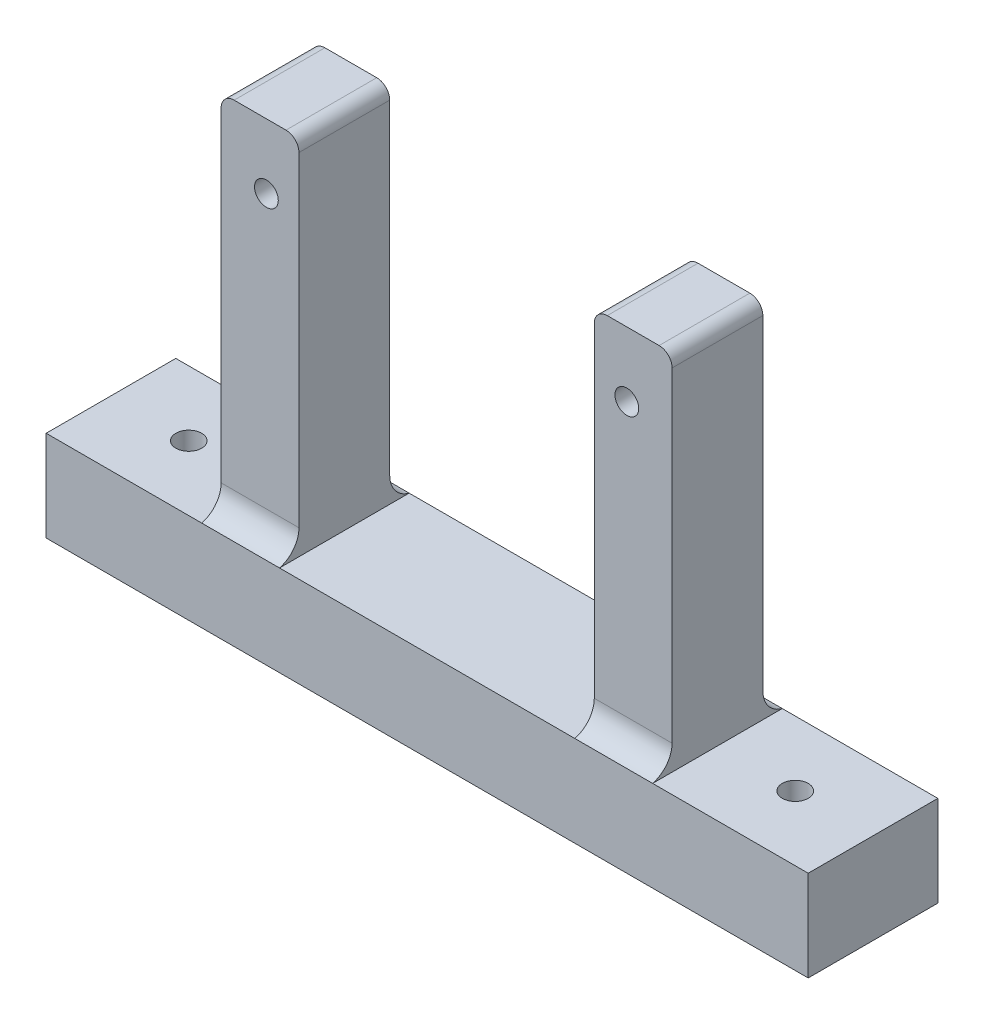
ISO-10303-21;
HEADER;
FILE_DESCRIPTION(('STEP AP214'),'2;1');
FILE_NAME('part.step','',(''),(''),'','','');
FILE_SCHEMA(('AUTOMOTIVE_DESIGN { 1 0 10303 214 1 1 1 1 }'));
ENDSEC;
DATA;
#1=APPLICATION_CONTEXT('core data for automotive mechanical design processes');
#2=APPLICATION_PROTOCOL_DEFINITION('international standard','automotive_design',2000,#1);
#3=PRODUCT_CONTEXT('',#1,'mechanical');
#4=PRODUCT('Part','Part','',(#3));
#5=PRODUCT_RELATED_PRODUCT_CATEGORY('part','',(#4));
#6=PRODUCT_DEFINITION_FORMATION('','',#4);
#7=PRODUCT_DEFINITION_CONTEXT('part definition',#1,'design');
#8=PRODUCT_DEFINITION('design','',#6,#7);
#9=PRODUCT_DEFINITION_SHAPE('','',#8);
#10=(LENGTH_UNIT() NAMED_UNIT(*) SI_UNIT(.MILLI.,.METRE.));
#11=(NAMED_UNIT(*) PLANE_ANGLE_UNIT() SI_UNIT($,.RADIAN.));
#12=(NAMED_UNIT(*) SI_UNIT($,.STERADIAN.) SOLID_ANGLE_UNIT());
#13=UNCERTAINTY_MEASURE_WITH_UNIT(LENGTH_MEASURE(1.E-05),#10,'distance_accuracy_value','');
#14=(GEOMETRIC_REPRESENTATION_CONTEXT(3) GLOBAL_UNCERTAINTY_ASSIGNED_CONTEXT((#13)) GLOBAL_UNIT_ASSIGNED_CONTEXT((#10,
#11,#12)) REPRESENTATION_CONTEXT('',''));
#15=CARTESIAN_POINT('',(0.,0.,0.));
#16=DIRECTION('',(0.,0.,1.));
#17=DIRECTION('',(1.,0.,0.));
#18=AXIS2_PLACEMENT_3D('',#15,#16,#17);
#19=CARTESIAN_POINT('',(0.,7.,0.));
#20=DIRECTION('',(0.,-1.,0.));
#21=DIRECTION('',(0.,0.,-1.));
#22=AXIS2_PLACEMENT_3D('',#19,#20,#21);
#23=PLANE('',#22);
#24=CARTESIAN_POINT('',(-23.39,7.,0.));
#25=DIRECTION('',(0.,1.,0.));
#26=DIRECTION('',(0.,0.,1.));
#27=AXIS2_PLACEMENT_3D('',#24,#25,#26);
#28=CIRCLE('',#27,1.);
#29=CARTESIAN_POINT('',(-23.39,7.,1.));
#30=VERTEX_POINT('',#29);
#31=EDGE_CURVE('E480',#30,#30,#28,.T.);
#32=ORIENTED_EDGE('',*,*,#31,.F.);
#33=EDGE_LOOP('',(#32));
#34=FACE_BOUND('',#33,.T.);
#35=DIRECTION('',(0.,0.,1.));
#36=VECTOR('',#35,1.);
#37=CARTESIAN_POINT('',(-17.39,7.,0.));
#38=LINE('',#37,#36);
#39=CARTESIAN_POINT('',(-17.39,7.,-5.));
#40=VERTEX_POINT('',#39);
#41=CARTESIAN_POINT('',(-17.39,7.,5.));
#42=VERTEX_POINT('',#41);
#43=EDGE_CURVE('E301',#40,#42,#38,.T.);
#44=ORIENTED_EDGE('',*,*,#43,.F.);
#45=DIRECTION('',(-1.,0.,0.));
#46=VECTOR('',#45,1.);
#47=CARTESIAN_POINT('',(-29.39,7.,-5.));
#48=LINE('',#47,#46);
#49=CARTESIAN_POINT('',(-29.39,7.,-5.));
#50=VERTEX_POINT('',#49);
#51=EDGE_CURVE('E186',#40,#50,#48,.T.);
#52=ORIENTED_EDGE('',*,*,#51,.T.);
#53=DIRECTION('',(0.,0.,1.));
#54=VECTOR('',#53,1.);
#55=CARTESIAN_POINT('',(-29.39,7.,5.));
#56=LINE('',#55,#54);
#57=CARTESIAN_POINT('',(-29.39,7.,5.));
#58=VERTEX_POINT('',#57);
#59=EDGE_CURVE('E184',#50,#58,#56,.T.);
#60=ORIENTED_EDGE('',*,*,#59,.T.);
#61=DIRECTION('',(1.,0.,0.));
#62=VECTOR('',#61,1.);
#63=CARTESIAN_POINT('',(-29.39,7.,5.));
#64=LINE('',#63,#62);
#65=EDGE_CURVE('E306',#58,#42,#64,.T.);
#66=ORIENTED_EDGE('',*,*,#65,.T.);
#67=EDGE_LOOP('',(#44,#52,#60,#66));
#68=FACE_BOUND('',#67,.T.);
#69=ADVANCED_FACE('F33',(#34,#68),#23,.F.);
#70=CARTESIAN_POINT('',(23.39,7.,0.));
#71=DIRECTION('',(0.,1.,0.));
#72=DIRECTION('',(0.,0.,1.));
#73=AXIS2_PLACEMENT_3D('',#70,#71,#72);
#74=CIRCLE('',#73,1.);
#75=CARTESIAN_POINT('',(23.39,7.,1.));
#76=VERTEX_POINT('',#75);
#77=EDGE_CURVE('E486',#76,#76,#74,.T.);
#78=ORIENTED_EDGE('',*,*,#77,.F.);
#79=EDGE_LOOP('',(#78));
#80=FACE_BOUND('',#79,.T.);
#81=CARTESIAN_POINT('',(29.39,7.,-5.));
#82=VERTEX_POINT('',#81);
#83=CARTESIAN_POINT('',(17.39,7.,-5.));
#84=VERTEX_POINT('',#83);
#85=EDGE_CURVE('E174',#82,#84,#48,.T.);
#86=ORIENTED_EDGE('',*,*,#85,.T.);
#87=DIRECTION('',(0.,0.,-1.));
#88=VECTOR('',#87,1.);
#89=CARTESIAN_POINT('',(17.39,7.,0.));
#90=LINE('',#89,#88);
#91=CARTESIAN_POINT('',(17.39,7.,5.));
#92=VERTEX_POINT('',#91);
#93=EDGE_CURVE('E352',#92,#84,#90,.T.);
#94=ORIENTED_EDGE('',*,*,#93,.F.);
#95=CARTESIAN_POINT('',(29.39,7.,5.));
#96=VERTEX_POINT('',#95);
#97=EDGE_CURVE('E191',#92,#96,#64,.T.);
#98=ORIENTED_EDGE('',*,*,#97,.T.);
#99=DIRECTION('',(0.,0.,-1.));
#100=VECTOR('',#99,1.);
#101=CARTESIAN_POINT('',(29.39,7.,5.));
#102=LINE('',#101,#100);
#103=EDGE_CURVE('E188',#96,#82,#102,.T.);
#104=ORIENTED_EDGE('',*,*,#103,.T.);
#105=EDGE_LOOP('',(#86,#94,#98,#104));
#106=FACE_BOUND('',#105,.T.);
#107=ADVANCED_FACE('F189',(#80,#106),#23,.F.);
#108=CARTESIAN_POINT('',(11.39,7.,-5.));
#109=VERTEX_POINT('',#108);
#110=CARTESIAN_POINT('',(-11.39,7.,-5.));
#111=VERTEX_POINT('',#110);
#112=EDGE_CURVE('E336',#109,#111,#48,.T.);
#113=ORIENTED_EDGE('',*,*,#112,.T.);
#114=DIRECTION('',(0.,0.,-1.));
#115=VECTOR('',#114,1.);
#116=CARTESIAN_POINT('',(-11.39,7.,0.));
#117=LINE('',#116,#115);
#118=CARTESIAN_POINT('',(-11.39,7.,5.));
#119=VERTEX_POINT('',#118);
#120=EDGE_CURVE('E303',#119,#111,#117,.T.);
#121=ORIENTED_EDGE('',*,*,#120,.F.);
#122=CARTESIAN_POINT('',(11.39,7.,5.));
#123=VERTEX_POINT('',#122);
#124=EDGE_CURVE('E451',#119,#123,#64,.T.);
#125=ORIENTED_EDGE('',*,*,#124,.T.);
#126=DIRECTION('',(0.,0.,1.));
#127=VECTOR('',#126,1.);
#128=CARTESIAN_POINT('',(11.39,7.,0.));
#129=LINE('',#128,#127);
#130=EDGE_CURVE('E368',#109,#123,#129,.T.);
#131=ORIENTED_EDGE('',*,*,#130,.F.);
#132=EDGE_LOOP('',(#113,#121,#125,#131));
#133=FACE_BOUND('',#132,.T.);
#134=ADVANCED_FACE('F394',(#133),#23,.F.);
#135=CARTESIAN_POINT('',(29.39,7.,5.));
#136=DIRECTION('',(-1.,0.,0.));
#137=DIRECTION('',(0.,0.,1.));
#138=AXIS2_PLACEMENT_3D('',#135,#136,#137);
#139=PLANE('',#138);
#140=DIRECTION('',(0.,0.,-1.));
#141=VECTOR('',#140,1.);
#142=CARTESIAN_POINT('',(29.39,0.,5.));
#143=LINE('',#142,#141);
#144=CARTESIAN_POINT('',(29.39,0.,5.));
#145=VERTEX_POINT('',#144);
#146=CARTESIAN_POINT('',(29.39,0.,-5.));
#147=VERTEX_POINT('',#146);
#148=EDGE_CURVE('E199',#145,#147,#143,.T.);
#149=ORIENTED_EDGE('',*,*,#148,.T.);
#150=DIRECTION('',(0.,-1.,0.));
#151=VECTOR('',#150,1.);
#152=CARTESIAN_POINT('',(29.39,7.,-5.));
#153=LINE('',#152,#151);
#154=EDGE_CURVE('E178',#82,#147,#153,.T.);
#155=ORIENTED_EDGE('',*,*,#154,.F.);
#156=ORIENTED_EDGE('',*,*,#103,.F.);
#157=DIRECTION('',(0.,-1.,0.));
#158=VECTOR('',#157,1.);
#159=CARTESIAN_POINT('',(29.39,7.,5.));
#160=LINE('',#159,#158);
#161=EDGE_CURVE('E309',#96,#145,#160,.T.);
#162=ORIENTED_EDGE('',*,*,#161,.T.);
#163=EDGE_LOOP('',(#149,#155,#156,#162));
#164=FACE_BOUND('',#163,.T.);
#165=ADVANCED_FACE('F197',(#164),#139,.F.);
#166=CARTESIAN_POINT('',(-29.39,7.,-5.));
#167=DIRECTION('',(0.,0.,1.));
#168=DIRECTION('',(1.,0.,0.));
#169=AXIS2_PLACEMENT_3D('',#166,#167,#168);
#170=PLANE('',#169);
#171=DIRECTION('',(-1.,0.,0.));
#172=VECTOR('',#171,1.);
#173=CARTESIAN_POINT('',(-29.39,0.,-5.));
#174=LINE('',#173,#172);
#175=CARTESIAN_POINT('',(-29.39,0.,-5.));
#176=VERTEX_POINT('',#175);
#177=EDGE_CURVE('E312',#147,#176,#174,.T.);
#178=ORIENTED_EDGE('',*,*,#177,.T.);
#179=DIRECTION('',(0.,-1.,0.));
#180=VECTOR('',#179,1.);
#181=CARTESIAN_POINT('',(-29.39,7.,-5.));
#182=LINE('',#181,#180);
#183=EDGE_CURVE('E201',#50,#176,#182,.T.);
#184=ORIENTED_EDGE('',*,*,#183,.F.);
#185=ORIENTED_EDGE('',*,*,#51,.F.);
#186=EDGE_CURVE('E335',#111,#40,#48,.T.);
#187=ORIENTED_EDGE('',*,*,#186,.F.);
#188=ORIENTED_EDGE('',*,*,#112,.F.);
#189=EDGE_CURVE('E182',#84,#109,#48,.T.);
#190=ORIENTED_EDGE('',*,*,#189,.F.);
#191=ORIENTED_EDGE('',*,*,#85,.F.);
#192=ORIENTED_EDGE('',*,*,#154,.T.);
#193=EDGE_LOOP('',(#178,#184,#185,#187,#188,#190,#191,#192));
#194=FACE_BOUND('',#193,.T.);
#195=ADVANCED_FACE('F176',(#194),#170,.F.);
#196=CARTESIAN_POINT('',(-29.39,7.,5.));
#197=DIRECTION('',(1.,0.,0.));
#198=DIRECTION('',(0.,0.,-1.));
#199=AXIS2_PLACEMENT_3D('',#196,#197,#198);
#200=PLANE('',#199);
#201=DIRECTION('',(0.,0.,1.));
#202=VECTOR('',#201,1.);
#203=CARTESIAN_POINT('',(-29.39,0.,5.));
#204=LINE('',#203,#202);
#205=CARTESIAN_POINT('',(-29.39,0.,5.));
#206=VERTEX_POINT('',#205);
#207=EDGE_CURVE('E314',#176,#206,#204,.T.);
#208=ORIENTED_EDGE('',*,*,#207,.T.);
#209=DIRECTION('',(0.,-1.,0.));
#210=VECTOR('',#209,1.);
#211=CARTESIAN_POINT('',(-29.39,7.,5.));
#212=LINE('',#211,#210);
#213=EDGE_CURVE('E207',#58,#206,#212,.T.);
#214=ORIENTED_EDGE('',*,*,#213,.F.);
#215=ORIENTED_EDGE('',*,*,#59,.F.);
#216=ORIENTED_EDGE('',*,*,#183,.T.);
#217=EDGE_LOOP('',(#208,#214,#215,#216));
#218=FACE_BOUND('',#217,.T.);
#219=ADVANCED_FACE('F331',(#218),#200,.F.);
#220=CARTESIAN_POINT('',(-29.39,7.,5.));
#221=DIRECTION('',(0.,0.,-1.));
#222=DIRECTION('',(-1.,0.,0.));
#223=AXIS2_PLACEMENT_3D('',#220,#221,#222);
#224=PLANE('',#223);
#225=DIRECTION('',(1.,0.,0.));
#226=VECTOR('',#225,1.);
#227=CARTESIAN_POINT('',(-29.39,0.,5.));
#228=LINE('',#227,#226);
#229=EDGE_CURVE('E195',#206,#145,#228,.T.);
#230=ORIENTED_EDGE('',*,*,#229,.T.);
#231=ORIENTED_EDGE('',*,*,#161,.F.);
#232=ORIENTED_EDGE('',*,*,#97,.F.);
#233=EDGE_CURVE('E452',#123,#92,#64,.T.);
#234=ORIENTED_EDGE('',*,*,#233,.F.);
#235=ORIENTED_EDGE('',*,*,#124,.F.);
#236=EDGE_CURVE('E310',#42,#119,#64,.T.);
#237=ORIENTED_EDGE('',*,*,#236,.F.);
#238=ORIENTED_EDGE('',*,*,#65,.F.);
#239=ORIENTED_EDGE('',*,*,#213,.T.);
#240=EDGE_LOOP('',(#230,#231,#232,#234,#235,#237,#238,#239));
#241=FACE_BOUND('',#240,.T.);
#242=ADVANCED_FACE('F322',(#241),#224,.F.);
#243=CARTESIAN_POINT('',(0.,0.,0.));
#244=DIRECTION('',(0.,-1.,0.));
#245=DIRECTION('',(0.,0.,-1.));
#246=AXIS2_PLACEMENT_3D('',#243,#244,#245);
#247=PLANE('',#246);
#248=CARTESIAN_POINT('',(23.39,0.,0.));
#249=DIRECTION('',(0.,1.,0.));
#250=DIRECTION('',(0.,0.,1.));
#251=AXIS2_PLACEMENT_3D('',#248,#249,#250);
#252=CIRCLE('',#251,1.);
#253=CARTESIAN_POINT('',(23.39,0.,1.));
#254=VERTEX_POINT('',#253);
#255=EDGE_CURVE('E483',#254,#254,#252,.T.);
#256=ORIENTED_EDGE('',*,*,#255,.T.);
#257=EDGE_LOOP('',(#256));
#258=FACE_BOUND('',#257,.T.);
#259=CARTESIAN_POINT('',(-23.39,0.,0.));
#260=DIRECTION('',(0.,1.,0.));
#261=DIRECTION('',(0.,0.,1.));
#262=AXIS2_PLACEMENT_3D('',#259,#260,#261);
#263=CIRCLE('',#262,1.);
#264=CARTESIAN_POINT('',(-23.39,0.,1.));
#265=VERTEX_POINT('',#264);
#266=EDGE_CURVE('E477',#265,#265,#263,.T.);
#267=ORIENTED_EDGE('',*,*,#266,.T.);
#268=EDGE_LOOP('',(#267));
#269=FACE_BOUND('',#268,.T.);
#270=ORIENTED_EDGE('',*,*,#148,.F.);
#271=ORIENTED_EDGE('',*,*,#229,.F.);
#272=ORIENTED_EDGE('',*,*,#207,.F.);
#273=ORIENTED_EDGE('',*,*,#177,.F.);
#274=EDGE_LOOP('',(#270,#271,#272,#273));
#275=FACE_BOUND('',#274,.T.);
#276=ADVANCED_FACE('F328',(#258,#269,#275),#247,.T.);
#277=CARTESIAN_POINT('',(0.,0.,3.5));
#278=DIRECTION('',(0.,0.,1.));
#279=DIRECTION('',(1.,0.,0.));
#280=AXIS2_PLACEMENT_3D('',#277,#278,#279);
#281=PLANE('',#280);
#282=CARTESIAN_POINT('',(-13.9,30.,3.5));
#283=DIRECTION('',(0.,0.,1.));
#284=DIRECTION('',(1.,0.,0.));
#285=AXIS2_PLACEMENT_3D('',#282,#283,#284);
#286=CIRCLE('',#285,0.915000000000001);
#287=CARTESIAN_POINT('',(-12.985,30.,3.5));
#288=VERTEX_POINT('',#287);
#289=EDGE_CURVE('E291',#288,#288,#286,.T.);
#290=ORIENTED_EDGE('',*,*,#289,.F.);
#291=EDGE_LOOP('',(#290));
#292=FACE_BOUND('',#291,.T.);
#293=DIRECTION('',(0.,1.,0.));
#294=VECTOR('',#293,1.);
#295=CARTESIAN_POINT('',(-11.39,0.,3.5));
#296=LINE('',#295,#294);
#297=CARTESIAN_POINT('',(-11.39,8.93649167310371,3.5));
#298=VERTEX_POINT('',#297);
#299=CARTESIAN_POINT('',(-11.39,34.,3.5));
#300=VERTEX_POINT('',#299);
#301=EDGE_CURVE('E272',#298,#300,#296,.T.);
#302=ORIENTED_EDGE('',*,*,#301,.T.);
#303=CARTESIAN_POINT('',(-12.39,34.,3.5));
#304=DIRECTION('',(0.,0.,1.));
#305=DIRECTION('',(1.,0.,0.));
#306=AXIS2_PLACEMENT_3D('',#303,#304,#305);
#307=CIRCLE('',#306,1.);
#308=CARTESIAN_POINT('',(-12.39,35.,3.5));
#309=VERTEX_POINT('',#308);
#310=EDGE_CURVE('E41',#300,#309,#307,.T.);
#311=ORIENTED_EDGE('',*,*,#310,.T.);
#312=DIRECTION('',(-1.,0.,0.));
#313=VECTOR('',#312,1.);
#314=CARTESIAN_POINT('',(-11.39,35.,3.5));
#315=LINE('',#314,#313);
#316=CARTESIAN_POINT('',(-16.39,35.,3.5));
#317=VERTEX_POINT('',#316);
#318=EDGE_CURVE('E271',#309,#317,#315,.T.);
#319=ORIENTED_EDGE('',*,*,#318,.T.);
#320=CARTESIAN_POINT('',(-16.39,34.,3.5));
#321=DIRECTION('',(0.,0.,1.));
#322=DIRECTION('',(1.,0.,0.));
#323=AXIS2_PLACEMENT_3D('',#320,#321,#322);
#324=CIRCLE('',#323,1.);
#325=CARTESIAN_POINT('',(-17.39,34.,3.5));
#326=VERTEX_POINT('',#325);
#327=EDGE_CURVE('E48',#317,#326,#324,.T.);
#328=ORIENTED_EDGE('',*,*,#327,.T.);
#329=DIRECTION('',(0.,-1.,0.));
#330=VECTOR('',#329,1.);
#331=CARTESIAN_POINT('',(-17.39,0.,3.5));
#332=LINE('',#331,#330);
#333=CARTESIAN_POINT('',(-17.39,8.93649167310371,3.5));
#334=VERTEX_POINT('',#333);
#335=EDGE_CURVE('E280',#326,#334,#332,.T.);
#336=ORIENTED_EDGE('',*,*,#335,.T.);
#337=DIRECTION('',(-1.,0.,0.));
#338=VECTOR('',#337,1.);
#339=CARTESIAN_POINT('',(-11.39,8.93649167310371,3.5));
#340=LINE('',#339,#338);
#341=EDGE_CURVE('E216',#334,#298,#340,.F.);
#342=ORIENTED_EDGE('',*,*,#341,.T.);
#343=EDGE_LOOP('',(#302,#311,#319,#328,#336,#342));
#344=FACE_BOUND('',#343,.T.);
#345=ADVANCED_FACE('F270',(#292,#344),#281,.T.);
#346=CARTESIAN_POINT('',(0.,0.,-3.5));
#347=DIRECTION('',(0.,0.,1.));
#348=DIRECTION('',(1.,0.,0.));
#349=AXIS2_PLACEMENT_3D('',#346,#347,#348);
#350=PLANE('',#349);
#351=CARTESIAN_POINT('',(-13.9,30.,-3.5));
#352=DIRECTION('',(0.,0.,1.));
#353=DIRECTION('',(1.,0.,0.));
#354=AXIS2_PLACEMENT_3D('',#351,#352,#353);
#355=CIRCLE('',#354,0.915000000000001);
#356=CARTESIAN_POINT('',(-12.985,30.,-3.5));
#357=VERTEX_POINT('',#356);
#358=EDGE_CURVE('E296',#357,#357,#355,.T.);
#359=ORIENTED_EDGE('',*,*,#358,.T.);
#360=EDGE_LOOP('',(#359));
#361=FACE_BOUND('',#360,.T.);
#362=DIRECTION('',(-1.,0.,0.));
#363=VECTOR('',#362,1.);
#364=CARTESIAN_POINT('',(-11.39,35.,-3.5));
#365=LINE('',#364,#363);
#366=CARTESIAN_POINT('',(-12.39,35.,-3.5));
#367=VERTEX_POINT('',#366);
#368=CARTESIAN_POINT('',(-16.39,35.,-3.5));
#369=VERTEX_POINT('',#368);
#370=EDGE_CURVE('E288',#367,#369,#365,.T.);
#371=ORIENTED_EDGE('',*,*,#370,.F.);
#372=CARTESIAN_POINT('',(-12.39,34.,-3.5));
#373=DIRECTION('',(0.,0.,1.));
#374=DIRECTION('',(1.,0.,0.));
#375=AXIS2_PLACEMENT_3D('',#372,#373,#374);
#376=CIRCLE('',#375,1.);
#377=CARTESIAN_POINT('',(-11.39,34.,-3.5));
#378=VERTEX_POINT('',#377);
#379=EDGE_CURVE('E265',#367,#378,#376,.F.);
#380=ORIENTED_EDGE('',*,*,#379,.T.);
#381=DIRECTION('',(0.,1.,0.));
#382=VECTOR('',#381,1.);
#383=CARTESIAN_POINT('',(-11.39,0.,-3.5));
#384=LINE('',#383,#382);
#385=CARTESIAN_POINT('',(-11.39,8.93649167310371,-3.5));
#386=VERTEX_POINT('',#385);
#387=EDGE_CURVE('E286',#386,#378,#384,.T.);
#388=ORIENTED_EDGE('',*,*,#387,.F.);
#389=DIRECTION('',(-1.,0.,0.));
#390=VECTOR('',#389,1.);
#391=CARTESIAN_POINT('',(0.,8.93649167310371,-3.5));
#392=LINE('',#391,#390);
#393=CARTESIAN_POINT('',(-17.39,8.93649167310371,-3.5));
#394=VERTEX_POINT('',#393);
#395=EDGE_CURVE('E200',#386,#394,#392,.T.);
#396=ORIENTED_EDGE('',*,*,#395,.T.);
#397=DIRECTION('',(0.,-1.,0.));
#398=VECTOR('',#397,1.);
#399=CARTESIAN_POINT('',(-17.39,0.,-3.5));
#400=LINE('',#399,#398);
#401=CARTESIAN_POINT('',(-17.39,34.,-3.5));
#402=VERTEX_POINT('',#401);
#403=EDGE_CURVE('E293',#402,#394,#400,.T.);
#404=ORIENTED_EDGE('',*,*,#403,.F.);
#405=CARTESIAN_POINT('',(-16.39,34.,-3.5));
#406=DIRECTION('',(0.,0.,1.));
#407=DIRECTION('',(1.,0.,0.));
#408=AXIS2_PLACEMENT_3D('',#405,#406,#407);
#409=CIRCLE('',#408,1.);
#410=EDGE_CURVE('E263',#402,#369,#409,.F.);
#411=ORIENTED_EDGE('',*,*,#410,.T.);
#412=EDGE_LOOP('',(#371,#380,#388,#396,#404,#411));
#413=FACE_BOUND('',#412,.T.);
#414=ADVANCED_FACE('F285',(#361,#413),#350,.F.);
#415=CARTESIAN_POINT('',(-11.39,0.,3.5));
#416=DIRECTION('',(-1.,0.,0.));
#417=DIRECTION('',(0.,0.,1.));
#418=AXIS2_PLACEMENT_3D('',#415,#416,#417);
#419=PLANE('',#418);
#420=ORIENTED_EDGE('',*,*,#387,.T.);
#421=DIRECTION('',(0.,0.,-1.));
#422=VECTOR('',#421,1.);
#423=CARTESIAN_POINT('',(-11.39,34.,3.5));
#424=LINE('',#423,#422);
#425=EDGE_CURVE('E56',#378,#300,#424,.F.);
#426=ORIENTED_EDGE('',*,*,#425,.T.);
#427=ORIENTED_EDGE('',*,*,#301,.F.);
#428=CARTESIAN_POINT('',(-11.39,8.93649167310371,5.5));
#429=DIRECTION('',(-1.,0.,0.));
#430=DIRECTION('',(0.,0.,1.));
#431=AXIS2_PLACEMENT_3D('',#428,#429,#430);
#432=CIRCLE('',#431,2.);
#433=EDGE_CURVE('E237',#298,#119,#432,.T.);
#434=ORIENTED_EDGE('',*,*,#433,.T.);
#435=ORIENTED_EDGE('',*,*,#120,.T.);
#436=CARTESIAN_POINT('',(-11.39,8.93649167310371,-5.5));
#437=DIRECTION('',(-1.,0.,0.));
#438=DIRECTION('',(0.,0.,1.));
#439=AXIS2_PLACEMENT_3D('',#436,#437,#438);
#440=CIRCLE('',#439,2.);
#441=EDGE_CURVE('E221',#111,#386,#440,.T.);
#442=ORIENTED_EDGE('',*,*,#441,.T.);
#443=EDGE_LOOP('',(#420,#426,#427,#434,#435,#442));
#444=FACE_BOUND('',#443,.T.);
#445=ADVANCED_FACE('F289',(#444),#419,.F.);
#446=CARTESIAN_POINT('',(-17.39,0.,3.5));
#447=DIRECTION('',(1.,0.,0.));
#448=DIRECTION('',(0.,0.,-1.));
#449=AXIS2_PLACEMENT_3D('',#446,#447,#448);
#450=PLANE('',#449);
#451=ORIENTED_EDGE('',*,*,#335,.F.);
#452=DIRECTION('',(0.,0.,-1.));
#453=VECTOR('',#452,1.);
#454=CARTESIAN_POINT('',(-17.39,34.,3.5));
#455=LINE('',#454,#453);
#456=EDGE_CURVE('E11',#326,#402,#455,.T.);
#457=ORIENTED_EDGE('',*,*,#456,.T.);
#458=ORIENTED_EDGE('',*,*,#403,.T.);
#459=CARTESIAN_POINT('',(-17.39,8.93649167310371,-5.5));
#460=DIRECTION('',(1.,0.,0.));
#461=DIRECTION('',(0.,0.,-1.));
#462=AXIS2_PLACEMENT_3D('',#459,#460,#461);
#463=CIRCLE('',#462,2.);
#464=EDGE_CURVE('E218',#394,#40,#463,.T.);
#465=ORIENTED_EDGE('',*,*,#464,.T.);
#466=ORIENTED_EDGE('',*,*,#43,.T.);
#467=CARTESIAN_POINT('',(-17.39,8.93649167310371,5.5));
#468=DIRECTION('',(1.,0.,0.));
#469=DIRECTION('',(0.,0.,-1.));
#470=AXIS2_PLACEMENT_3D('',#467,#468,#469);
#471=CIRCLE('',#470,2.);
#472=EDGE_CURVE('E234',#42,#334,#471,.T.);
#473=ORIENTED_EDGE('',*,*,#472,.T.);
#474=EDGE_LOOP('',(#451,#457,#458,#465,#466,#473));
#475=FACE_BOUND('',#474,.T.);
#476=ADVANCED_FACE('F387',(#475),#450,.F.);
#477=CARTESIAN_POINT('',(-11.39,35.,3.5));
#478=DIRECTION('',(0.,-1.,0.));
#479=DIRECTION('',(0.,0.,-1.));
#480=AXIS2_PLACEMENT_3D('',#477,#478,#479);
#481=PLANE('',#480);
#482=ORIENTED_EDGE('',*,*,#318,.F.);
#483=DIRECTION('',(0.,0.,-1.));
#484=VECTOR('',#483,1.);
#485=CARTESIAN_POINT('',(-12.39,35.,3.5));
#486=LINE('',#485,#484);
#487=EDGE_CURVE('E260',#309,#367,#486,.T.);
#488=ORIENTED_EDGE('',*,*,#487,.T.);
#489=ORIENTED_EDGE('',*,*,#370,.T.);
#490=DIRECTION('',(0.,0.,-1.));
#491=VECTOR('',#490,1.);
#492=CARTESIAN_POINT('',(-16.39,35.,3.5));
#493=LINE('',#492,#491);
#494=EDGE_CURVE('E258',#369,#317,#493,.F.);
#495=ORIENTED_EDGE('',*,*,#494,.T.);
#496=EDGE_LOOP('',(#482,#488,#489,#495));
#497=FACE_BOUND('',#496,.T.);
#498=ADVANCED_FACE('F276',(#497),#481,.F.);
#499=CARTESIAN_POINT('',(-13.9,30.,3.5));
#500=DIRECTION('',(0.,0.,-1.));
#501=DIRECTION('',(-1.,0.,0.));
#502=AXIS2_PLACEMENT_3D('',#499,#500,#501);
#503=CYLINDRICAL_SURFACE('',#502,0.915000000000001);
#504=ORIENTED_EDGE('',*,*,#289,.T.);
#505=EDGE_LOOP('',(#504));
#506=FACE_BOUND('',#505,.T.);
#507=ORIENTED_EDGE('',*,*,#358,.F.);
#508=EDGE_LOOP('',(#507));
#509=FACE_BOUND('',#508,.T.);
#510=ADVANCED_FACE('F376',(#506,#509),#503,.F.);
#511=CARTESIAN_POINT('',(0.,0.,3.5));
#512=DIRECTION('',(0.,0.,-1.));
#513=DIRECTION('',(-1.,0.,0.));
#514=AXIS2_PLACEMENT_3D('',#511,#512,#513);
#515=PLANE('',#514);
#516=CARTESIAN_POINT('',(13.9,30.,3.5));
#517=DIRECTION('',(0.,0.,1.));
#518=DIRECTION('',(1.,0.,0.));
#519=AXIS2_PLACEMENT_3D('',#516,#517,#518);
#520=CIRCLE('',#519,0.915000000000001);
#521=CARTESIAN_POINT('',(14.815,30.,3.5));
#522=VERTEX_POINT('',#521);
#523=EDGE_CURVE('E363',#522,#522,#520,.T.);
#524=ORIENTED_EDGE('',*,*,#523,.F.);
#525=EDGE_LOOP('',(#524));
#526=FACE_BOUND('',#525,.T.);
#527=DIRECTION('',(-1.,0.,0.));
#528=VECTOR('',#527,1.);
#529=CARTESIAN_POINT('',(11.39,35.,3.5));
#530=LINE('',#529,#528);
#531=CARTESIAN_POINT('',(16.39,35.,3.5));
#532=VERTEX_POINT('',#531);
#533=CARTESIAN_POINT('',(12.39,35.,3.5));
#534=VERTEX_POINT('',#533);
#535=EDGE_CURVE('E369',#532,#534,#530,.T.);
#536=ORIENTED_EDGE('',*,*,#535,.T.);
#537=CARTESIAN_POINT('',(12.39,34.,3.5));
#538=DIRECTION('',(0.,0.,-1.));
#539=DIRECTION('',(-1.,0.,0.));
#540=AXIS2_PLACEMENT_3D('',#537,#538,#539);
#541=CIRCLE('',#540,1.);
#542=CARTESIAN_POINT('',(11.39,34.,3.5));
#543=VERTEX_POINT('',#542);
#544=EDGE_CURVE('E254',#534,#543,#541,.F.);
#545=ORIENTED_EDGE('',*,*,#544,.T.);
#546=DIRECTION('',(0.,-1.,0.));
#547=VECTOR('',#546,1.);
#548=CARTESIAN_POINT('',(11.39,0.,3.5));
#549=LINE('',#548,#547);
#550=CARTESIAN_POINT('',(11.39,8.93649167310371,3.5));
#551=VERTEX_POINT('',#550);
#552=EDGE_CURVE('E361',#543,#551,#549,.T.);
#553=ORIENTED_EDGE('',*,*,#552,.T.);
#554=DIRECTION('',(1.,0.,0.));
#555=VECTOR('',#554,1.);
#556=CARTESIAN_POINT('',(0.,8.93649167310371,3.5));
#557=LINE('',#556,#555);
#558=CARTESIAN_POINT('',(17.39,8.93649167310371,3.5));
#559=VERTEX_POINT('',#558);
#560=EDGE_CURVE('E213',#551,#559,#557,.T.);
#561=ORIENTED_EDGE('',*,*,#560,.T.);
#562=DIRECTION('',(0.,1.,0.));
#563=VECTOR('',#562,1.);
#564=CARTESIAN_POINT('',(17.39,0.,3.5));
#565=LINE('',#564,#563);
#566=CARTESIAN_POINT('',(17.39,34.,3.5));
#567=VERTEX_POINT('',#566);
#568=EDGE_CURVE('E470',#559,#567,#565,.T.);
#569=ORIENTED_EDGE('',*,*,#568,.T.);
#570=CARTESIAN_POINT('',(16.39,34.,3.5));
#571=DIRECTION('',(0.,0.,-1.));
#572=DIRECTION('',(-1.,0.,0.));
#573=AXIS2_PLACEMENT_3D('',#570,#571,#572);
#574=CIRCLE('',#573,1.);
#575=EDGE_CURVE('E252',#567,#532,#574,.F.);
#576=ORIENTED_EDGE('',*,*,#575,.T.);
#577=EDGE_LOOP('',(#536,#545,#553,#561,#569,#576));
#578=FACE_BOUND('',#577,.T.);
#579=ADVANCED_FACE('F378',(#526,#578),#515,.F.);
#580=CARTESIAN_POINT('',(0.,0.,-3.5));
#581=DIRECTION('',(0.,0.,-1.));
#582=DIRECTION('',(-1.,0.,0.));
#583=AXIS2_PLACEMENT_3D('',#580,#581,#582);
#584=PLANE('',#583);
#585=CARTESIAN_POINT('',(13.9,30.,-3.5));
#586=DIRECTION('',(0.,0.,1.));
#587=DIRECTION('',(1.,0.,0.));
#588=AXIS2_PLACEMENT_3D('',#585,#586,#587);
#589=CIRCLE('',#588,0.915000000000001);
#590=CARTESIAN_POINT('',(14.815,30.,-3.5));
#591=VERTEX_POINT('',#590);
#592=EDGE_CURVE('E474',#591,#591,#589,.T.);
#593=ORIENTED_EDGE('',*,*,#592,.T.);
#594=EDGE_LOOP('',(#593));
#595=FACE_BOUND('',#594,.T.);
#596=DIRECTION('',(0.,-1.,0.));
#597=VECTOR('',#596,1.);
#598=CARTESIAN_POINT('',(11.39,0.,-3.5));
#599=LINE('',#598,#597);
#600=CARTESIAN_POINT('',(11.39,34.,-3.5));
#601=VERTEX_POINT('',#600);
#602=CARTESIAN_POINT('',(11.39,8.93649167310371,-3.5));
#603=VERTEX_POINT('',#602);
#604=EDGE_CURVE('E358',#601,#603,#599,.T.);
#605=ORIENTED_EDGE('',*,*,#604,.F.);
#606=CARTESIAN_POINT('',(12.39,34.,-3.5));
#607=DIRECTION('',(0.,0.,-1.));
#608=DIRECTION('',(-1.,0.,0.));
#609=AXIS2_PLACEMENT_3D('',#606,#607,#608);
#610=CIRCLE('',#609,1.);
#611=CARTESIAN_POINT('',(12.39,35.,-3.5));
#612=VERTEX_POINT('',#611);
#613=EDGE_CURVE('E245',#601,#612,#610,.T.);
#614=ORIENTED_EDGE('',*,*,#613,.T.);
#615=DIRECTION('',(-1.,0.,0.));
#616=VECTOR('',#615,1.);
#617=CARTESIAN_POINT('',(11.39,35.,-3.5));
#618=LINE('',#617,#616);
#619=CARTESIAN_POINT('',(16.39,35.,-3.5));
#620=VERTEX_POINT('',#619);
#621=EDGE_CURVE('E357',#620,#612,#618,.T.);
#622=ORIENTED_EDGE('',*,*,#621,.F.);
#623=CARTESIAN_POINT('',(16.39,34.,-3.5));
#624=DIRECTION('',(0.,0.,-1.));
#625=DIRECTION('',(-1.,0.,0.));
#626=AXIS2_PLACEMENT_3D('',#623,#624,#625);
#627=CIRCLE('',#626,1.);
#628=CARTESIAN_POINT('',(17.39,34.,-3.5));
#629=VERTEX_POINT('',#628);
#630=EDGE_CURVE('E243',#620,#629,#627,.T.);
#631=ORIENTED_EDGE('',*,*,#630,.T.);
#632=DIRECTION('',(0.,1.,0.));
#633=VECTOR('',#632,1.);
#634=CARTESIAN_POINT('',(17.39,0.,-3.5));
#635=LINE('',#634,#633);
#636=CARTESIAN_POINT('',(17.39,8.93649167310371,-3.5));
#637=VERTEX_POINT('',#636);
#638=EDGE_CURVE('E350',#637,#629,#635,.T.);
#639=ORIENTED_EDGE('',*,*,#638,.F.);
#640=DIRECTION('',(1.,0.,0.));
#641=VECTOR('',#640,1.);
#642=CARTESIAN_POINT('',(11.39,8.93649167310371,-3.5));
#643=LINE('',#642,#641);
#644=EDGE_CURVE('E204',#637,#603,#643,.F.);
#645=ORIENTED_EDGE('',*,*,#644,.T.);
#646=EDGE_LOOP('',(#605,#614,#622,#631,#639,#645));
#647=FACE_BOUND('',#646,.T.);
#648=ADVANCED_FACE('F355',(#595,#647),#584,.T.);
#649=CARTESIAN_POINT('',(11.39,0.,3.5));
#650=DIRECTION('',(1.,0.,0.));
#651=DIRECTION('',(0.,0.,-1.));
#652=AXIS2_PLACEMENT_3D('',#649,#650,#651);
#653=PLANE('',#652);
#654=ORIENTED_EDGE('',*,*,#552,.F.);
#655=DIRECTION('',(0.,0.,-1.));
#656=VECTOR('',#655,1.);
#657=CARTESIAN_POINT('',(11.39,34.,3.5));
#658=LINE('',#657,#656);
#659=EDGE_CURVE('E240',#543,#601,#658,.T.);
#660=ORIENTED_EDGE('',*,*,#659,.T.);
#661=ORIENTED_EDGE('',*,*,#604,.T.);
#662=CARTESIAN_POINT('',(11.39,8.93649167310371,-5.5));
#663=DIRECTION('',(1.,0.,0.));
#664=DIRECTION('',(0.,0.,-1.));
#665=AXIS2_PLACEMENT_3D('',#662,#663,#664);
#666=CIRCLE('',#665,2.);
#667=EDGE_CURVE('E225',#603,#109,#666,.T.);
#668=ORIENTED_EDGE('',*,*,#667,.T.);
#669=ORIENTED_EDGE('',*,*,#130,.T.);
#670=CARTESIAN_POINT('',(11.39,8.93649167310371,5.5));
#671=DIRECTION('',(1.,0.,0.));
#672=DIRECTION('',(0.,0.,-1.));
#673=AXIS2_PLACEMENT_3D('',#670,#671,#672);
#674=CIRCLE('',#673,2.);
#675=EDGE_CURVE('E231',#123,#551,#674,.T.);
#676=ORIENTED_EDGE('',*,*,#675,.T.);
#677=EDGE_LOOP('',(#654,#660,#661,#668,#669,#676));
#678=FACE_BOUND('',#677,.T.);
#679=ADVANCED_FACE('F458',(#678),#653,.F.);
#680=CARTESIAN_POINT('',(17.39,0.,3.5));
#681=DIRECTION('',(-1.,0.,0.));
#682=DIRECTION('',(0.,-1.,0.));
#683=AXIS2_PLACEMENT_3D('',#680,#681,#682);
#684=PLANE('',#683);
#685=ORIENTED_EDGE('',*,*,#638,.T.);
#686=DIRECTION('',(0.,0.,-1.));
#687=VECTOR('',#686,1.);
#688=CARTESIAN_POINT('',(17.39,34.,3.5));
#689=LINE('',#688,#687);
#690=EDGE_CURVE('E256',#629,#567,#689,.F.);
#691=ORIENTED_EDGE('',*,*,#690,.T.);
#692=ORIENTED_EDGE('',*,*,#568,.F.);
#693=CARTESIAN_POINT('',(17.39,8.93649167310371,5.5));
#694=DIRECTION('',(-1.,0.,0.));
#695=DIRECTION('',(0.,-1.,0.));
#696=AXIS2_PLACEMENT_3D('',#693,#694,#695);
#697=CIRCLE('',#696,2.);
#698=EDGE_CURVE('E228',#559,#92,#697,.T.);
#699=ORIENTED_EDGE('',*,*,#698,.T.);
#700=ORIENTED_EDGE('',*,*,#93,.T.);
#701=CARTESIAN_POINT('',(17.39,8.93649167310371,-5.5));
#702=DIRECTION('',(-1.,0.,0.));
#703=DIRECTION('',(0.,-1.,0.));
#704=AXIS2_PLACEMENT_3D('',#701,#702,#703);
#705=CIRCLE('',#704,2.);
#706=EDGE_CURVE('E223',#84,#637,#705,.T.);
#707=ORIENTED_EDGE('',*,*,#706,.T.);
#708=EDGE_LOOP('',(#685,#691,#692,#699,#700,#707));
#709=FACE_BOUND('',#708,.T.);
#710=ADVANCED_FACE('F349',(#709),#684,.F.);
#711=CARTESIAN_POINT('',(11.39,35.,3.5));
#712=DIRECTION('',(0.,-1.,0.));
#713=DIRECTION('',(0.,0.,-1.));
#714=AXIS2_PLACEMENT_3D('',#711,#712,#713);
#715=PLANE('',#714);
#716=ORIENTED_EDGE('',*,*,#621,.T.);
#717=DIRECTION('',(0.,0.,-1.));
#718=VECTOR('',#717,1.);
#719=CARTESIAN_POINT('',(12.39,35.,3.5));
#720=LINE('',#719,#718);
#721=EDGE_CURVE('E250',#612,#534,#720,.F.);
#722=ORIENTED_EDGE('',*,*,#721,.T.);
#723=ORIENTED_EDGE('',*,*,#535,.F.);
#724=DIRECTION('',(0.,0.,-1.));
#725=VECTOR('',#724,1.);
#726=CARTESIAN_POINT('',(16.39,35.,3.5));
#727=LINE('',#726,#725);
#728=EDGE_CURVE('E247',#532,#620,#727,.T.);
#729=ORIENTED_EDGE('',*,*,#728,.T.);
#730=EDGE_LOOP('',(#716,#722,#723,#729));
#731=FACE_BOUND('',#730,.T.);
#732=ADVANCED_FACE('F462',(#731),#715,.F.);
#733=CARTESIAN_POINT('',(13.9,30.,3.5));
#734=DIRECTION('',(0.,0.,-1.));
#735=DIRECTION('',(-1.,0.,0.));
#736=AXIS2_PLACEMENT_3D('',#733,#734,#735);
#737=CYLINDRICAL_SURFACE('',#736,0.915000000000001);
#738=ORIENTED_EDGE('',*,*,#523,.T.);
#739=EDGE_LOOP('',(#738));
#740=FACE_BOUND('',#739,.T.);
#741=ORIENTED_EDGE('',*,*,#592,.F.);
#742=EDGE_LOOP('',(#741));
#743=FACE_BOUND('',#742,.T.);
#744=ADVANCED_FACE('F502',(#740,#743),#737,.F.);
#745=CARTESIAN_POINT('',(-23.39,0.,0.));
#746=DIRECTION('',(0.,1.,0.));
#747=DIRECTION('',(0.,0.,1.));
#748=AXIS2_PLACEMENT_3D('',#745,#746,#747);
#749=CYLINDRICAL_SURFACE('',#748,1.);
#750=ORIENTED_EDGE('',*,*,#266,.F.);
#751=EDGE_LOOP('',(#750));
#752=FACE_BOUND('',#751,.T.);
#753=ORIENTED_EDGE('',*,*,#31,.T.);
#754=EDGE_LOOP('',(#753));
#755=FACE_BOUND('',#754,.T.);
#756=ADVANCED_FACE('F496',(#752,#755),#749,.F.);
#757=CARTESIAN_POINT('',(23.39,0.,0.));
#758=DIRECTION('',(0.,1.,0.));
#759=DIRECTION('',(0.,0.,1.));
#760=AXIS2_PLACEMENT_3D('',#757,#758,#759);
#761=CYLINDRICAL_SURFACE('',#760,1.);
#762=ORIENTED_EDGE('',*,*,#255,.F.);
#763=EDGE_LOOP('',(#762));
#764=FACE_BOUND('',#763,.T.);
#765=ORIENTED_EDGE('',*,*,#77,.T.);
#766=EDGE_LOOP('',(#765));
#767=FACE_BOUND('',#766,.T.);
#768=ADVANCED_FACE('F416',(#764,#767),#761,.F.);
#769=CARTESIAN_POINT('',(0.,8.93649167310371,-5.5));
#770=DIRECTION('',(-1.,0.,0.));
#771=DIRECTION('',(0.,0.,1.));
#772=AXIS2_PLACEMENT_3D('',#769,#770,#771);
#773=CYLINDRICAL_SURFACE('',#772,2.);
#774=ORIENTED_EDGE('',*,*,#441,.F.);
#775=ORIENTED_EDGE('',*,*,#186,.T.);
#776=ORIENTED_EDGE('',*,*,#464,.F.);
#777=ORIENTED_EDGE('',*,*,#395,.F.);
#778=EDGE_LOOP('',(#774,#775,#776,#777));
#779=FACE_BOUND('',#778,.T.);
#780=ADVANCED_FACE('F413',(#779),#773,.F.);
#781=CARTESIAN_POINT('',(0.,8.93649167310371,-5.5));
#782=DIRECTION('',(-1.,0.,0.));
#783=DIRECTION('',(0.,0.,1.));
#784=AXIS2_PLACEMENT_3D('',#781,#782,#783);
#785=CYLINDRICAL_SURFACE('',#784,2.);
#786=ORIENTED_EDGE('',*,*,#667,.F.);
#787=ORIENTED_EDGE('',*,*,#644,.F.);
#788=ORIENTED_EDGE('',*,*,#706,.F.);
#789=ORIENTED_EDGE('',*,*,#189,.T.);
#790=EDGE_LOOP('',(#786,#787,#788,#789));
#791=FACE_BOUND('',#790,.T.);
#792=ADVANCED_FACE('F344',(#791),#785,.F.);
#793=CARTESIAN_POINT('',(0.,8.93649167310371,5.5));
#794=DIRECTION('',(1.,0.,0.));
#795=DIRECTION('',(0.,0.,-1.));
#796=AXIS2_PLACEMENT_3D('',#793,#794,#795);
#797=CYLINDRICAL_SURFACE('',#796,2.);
#798=ORIENTED_EDGE('',*,*,#675,.F.);
#799=ORIENTED_EDGE('',*,*,#233,.T.);
#800=ORIENTED_EDGE('',*,*,#698,.F.);
#801=ORIENTED_EDGE('',*,*,#560,.F.);
#802=EDGE_LOOP('',(#798,#799,#800,#801));
#803=FACE_BOUND('',#802,.T.);
#804=ADVANCED_FACE('F419',(#803),#797,.F.);
#805=CARTESIAN_POINT('',(0.,8.93649167310371,5.5));
#806=DIRECTION('',(1.,0.,0.));
#807=DIRECTION('',(0.,0.,-1.));
#808=AXIS2_PLACEMENT_3D('',#805,#806,#807);
#809=CYLINDRICAL_SURFACE('',#808,2.);
#810=ORIENTED_EDGE('',*,*,#433,.F.);
#811=ORIENTED_EDGE('',*,*,#341,.F.);
#812=ORIENTED_EDGE('',*,*,#472,.F.);
#813=ORIENTED_EDGE('',*,*,#236,.T.);
#814=EDGE_LOOP('',(#810,#811,#812,#813));
#815=FACE_BOUND('',#814,.T.);
#816=ADVANCED_FACE('F422',(#815),#809,.F.);
#817=CARTESIAN_POINT('',(12.39,34.,3.5));
#818=DIRECTION('',(0.,0.,-1.));
#819=DIRECTION('',(-1.,0.,0.));
#820=AXIS2_PLACEMENT_3D('',#817,#818,#819);
#821=CYLINDRICAL_SURFACE('',#820,1.);
#822=ORIENTED_EDGE('',*,*,#544,.F.);
#823=ORIENTED_EDGE('',*,*,#721,.F.);
#824=ORIENTED_EDGE('',*,*,#613,.F.);
#825=ORIENTED_EDGE('',*,*,#659,.F.);
#826=EDGE_LOOP('',(#822,#823,#824,#825));
#827=FACE_BOUND('',#826,.T.);
#828=ADVANCED_FACE('F426',(#827),#821,.T.);
#829=CARTESIAN_POINT('',(16.39,34.,3.5));
#830=DIRECTION('',(0.,0.,-1.));
#831=DIRECTION('',(-1.,0.,0.));
#832=AXIS2_PLACEMENT_3D('',#829,#830,#831);
#833=CYLINDRICAL_SURFACE('',#832,1.);
#834=ORIENTED_EDGE('',*,*,#575,.F.);
#835=ORIENTED_EDGE('',*,*,#690,.F.);
#836=ORIENTED_EDGE('',*,*,#630,.F.);
#837=ORIENTED_EDGE('',*,*,#728,.F.);
#838=EDGE_LOOP('',(#834,#835,#836,#837));
#839=FACE_BOUND('',#838,.T.);
#840=ADVANCED_FACE('F430',(#839),#833,.T.);
#841=CARTESIAN_POINT('',(-12.39,34.,3.5));
#842=DIRECTION('',(0.,0.,-1.));
#843=DIRECTION('',(-1.,0.,0.));
#844=AXIS2_PLACEMENT_3D('',#841,#842,#843);
#845=CYLINDRICAL_SURFACE('',#844,1.);
#846=ORIENTED_EDGE('',*,*,#310,.F.);
#847=ORIENTED_EDGE('',*,*,#425,.F.);
#848=ORIENTED_EDGE('',*,*,#379,.F.);
#849=ORIENTED_EDGE('',*,*,#487,.F.);
#850=EDGE_LOOP('',(#846,#847,#848,#849));
#851=FACE_BOUND('',#850,.T.);
#852=ADVANCED_FACE('F282',(#851),#845,.T.);
#853=CARTESIAN_POINT('',(-16.39,34.,3.5));
#854=DIRECTION('',(0.,0.,-1.));
#855=DIRECTION('',(-1.,0.,0.));
#856=AXIS2_PLACEMENT_3D('',#853,#854,#855);
#857=CYLINDRICAL_SURFACE('',#856,1.);
#858=ORIENTED_EDGE('',*,*,#327,.F.);
#859=ORIENTED_EDGE('',*,*,#494,.F.);
#860=ORIENTED_EDGE('',*,*,#410,.F.);
#861=ORIENTED_EDGE('',*,*,#456,.F.);
#862=EDGE_LOOP('',(#858,#859,#860,#861));
#863=FACE_BOUND('',#862,.T.);
#864=ADVANCED_FACE('F35',(#863),#857,.T.);
#865=CLOSED_SHELL('',(#69,#107,#134,#165,#195,#219,#242,#276,#345,#414,#445,#476,#498,#510,#579,
#648,#679,#710,#732,#744,#756,#768,#780,#792,#804,#816,#828,#840,#852,#864));
#866=MANIFOLD_SOLID_BREP('B2',#865);
#867=ADVANCED_BREP_SHAPE_REPRESENTATION('',(#18,#866),#14);
#868=SHAPE_DEFINITION_REPRESENTATION(#9,#867);
ENDSEC;
END-ISO-10303-21;
